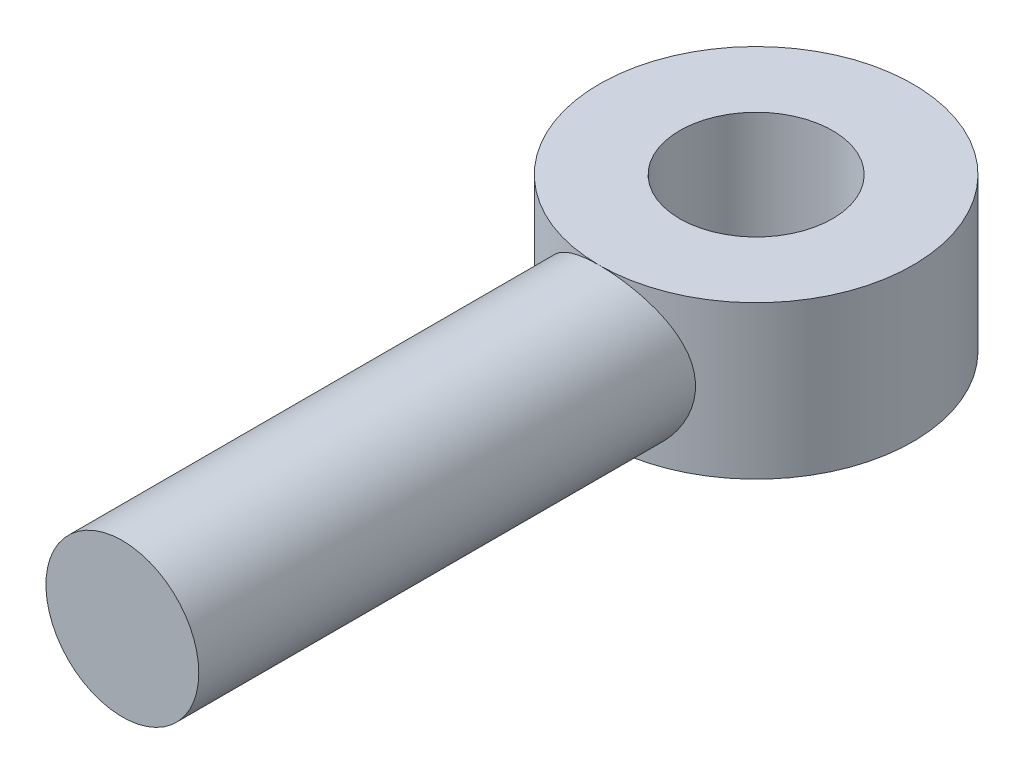
ISO-10303-21;
HEADER;
FILE_DESCRIPTION(('STEP AP214'),'2;1');
FILE_NAME('part.step','',(''),(''),'','','');
FILE_SCHEMA(('AUTOMOTIVE_DESIGN { 1 0 10303 214 1 1 1 1 }'));
ENDSEC;
DATA;
#1=APPLICATION_CONTEXT('core data for automotive mechanical design processes');
#2=APPLICATION_PROTOCOL_DEFINITION('international standard','automotive_design',2000,#1);
#3=PRODUCT_CONTEXT('',#1,'mechanical');
#4=PRODUCT('Part','Part','',(#3));
#5=PRODUCT_RELATED_PRODUCT_CATEGORY('part','',(#4));
#6=PRODUCT_DEFINITION_FORMATION('','',#4);
#7=PRODUCT_DEFINITION_CONTEXT('part definition',#1,'design');
#8=PRODUCT_DEFINITION('design','',#6,#7);
#9=PRODUCT_DEFINITION_SHAPE('','',#8);
#10=(LENGTH_UNIT() NAMED_UNIT(*) SI_UNIT(.MILLI.,.METRE.));
#11=(NAMED_UNIT(*) PLANE_ANGLE_UNIT() SI_UNIT($,.RADIAN.));
#12=(NAMED_UNIT(*) SI_UNIT($,.STERADIAN.) SOLID_ANGLE_UNIT());
#13=UNCERTAINTY_MEASURE_WITH_UNIT(LENGTH_MEASURE(1.E-05),#10,'distance_accuracy_value','');
#14=(GEOMETRIC_REPRESENTATION_CONTEXT(3) GLOBAL_UNCERTAINTY_ASSIGNED_CONTEXT((#13)) GLOBAL_UNIT_ASSIGNED_CONTEXT((#10,
#11,#12)) REPRESENTATION_CONTEXT('',''));
#15=CARTESIAN_POINT('',(0.,0.,0.));
#16=DIRECTION('',(0.,0.,1.));
#17=DIRECTION('',(1.,0.,0.));
#18=AXIS2_PLACEMENT_3D('',#15,#16,#17);
#19=CARTESIAN_POINT('',(0.,0.,130.));
#20=DIRECTION('',(0.,0.,-1.));
#21=DIRECTION('',(-1.,0.,0.));
#22=AXIS2_PLACEMENT_3D('',#19,#20,#21);
#23=CYLINDRICAL_SURFACE('',#22,20.);
#24=CARTESIAN_POINT('',(0.,0.,130.));
#25=DIRECTION('',(0.,0.,1.));
#26=DIRECTION('',(1.,0.,0.));
#27=AXIS2_PLACEMENT_3D('',#24,#25,#26);
#28=CIRCLE('',#27,20.);
#29=CARTESIAN_POINT('',(20.,0.,130.));
#30=VERTEX_POINT('',#29);
#31=EDGE_CURVE('E11',#30,#30,#28,.T.);
#32=ORIENTED_EDGE('',*,*,#31,.F.);
#33=EDGE_LOOP('',(#32));
#34=FACE_BOUND('',#33,.T.);
#35=CARTESIAN_POINT('',(-20.,0.,0.));
#36=CARTESIAN_POINT('',(-19.9999968305717,0.523388942620858,4.01317243572069E-06));
#37=CARTESIAN_POINT('',(-19.9794268216867,1.04684781891932,0.0114986192323871));
#38=CARTESIAN_POINT('',(-19.8974037196796,2.089772356522,0.0570611875570546));
#39=CARTESIAN_POINT('',(-19.8359302852922,2.60923590086667,0.0911403810986639));
#40=CARTESIAN_POINT('',(-19.672741328074,3.64095356517407,0.180702079364951));
#41=CARTESIAN_POINT('',(-19.5709479610997,4.1531917424507,0.236225981365262));
#42=CARTESIAN_POINT('',(-19.3283802054113,5.16572816217148,0.366698157030428));
#43=CARTESIAN_POINT('',(-19.1876099433925,5.66602766254064,0.441644374295622));
#44=CARTESIAN_POINT('',(-18.869434160805,6.64906067789953,0.608046821209087));
#45=CARTESIAN_POINT('',(-18.6922205829192,7.131871237707,0.699416246389992));
#46=CARTESIAN_POINT('',(-18.3023623602809,8.07999363351323,0.896145800921608));
#47=CARTESIAN_POINT('',(-18.0897168862446,8.54530505963211,1.0015062577208));
#48=CARTESIAN_POINT('',(-17.6307323022821,9.45607015952388,1.2232380255342));
#49=CARTESIAN_POINT('',(-17.3844024280961,9.90152923226694,1.33960631568466));
#50=CARTESIAN_POINT('',(-16.85954483436,10.7709664066188,1.58041765937314));
#51=CARTESIAN_POINT('',(-16.5810053002478,11.1949365435079,1.70486366844396));
#52=CARTESIAN_POINT('',(-15.9704472791634,12.051665131002,1.96870710493953));
#53=CARTESIAN_POINT('',(-15.6359529666301,12.4825347573725,2.10851401122974));
#54=CARTESIAN_POINT('',(-14.9333125894561,13.3151396216145,2.39033786816231));
#55=CARTESIAN_POINT('',(-14.5651648486048,13.7168734064982,2.53235492859543));
#56=CARTESIAN_POINT('',(-13.7968244500466,14.4894656526114,2.81513198905908));
#57=CARTESIAN_POINT('',(-13.3966116809057,14.8603044341186,2.95589113762522));
#58=CARTESIAN_POINT('',(-12.566397661536,15.5686644264076,3.23257220903354));
#59=CARTESIAN_POINT('',(-12.1364065162212,15.9061968459155,3.36849574930764));
#60=CARTESIAN_POINT('',(-11.2203326518424,16.5663136468508,3.64063791338961));
#61=CARTESIAN_POINT('',(-10.7324219186742,16.8865865977177,3.77632684070432));
#62=CARTESIAN_POINT('',(-9.72786239205824,17.4845752377918,4.03477334660886));
#63=CARTESIAN_POINT('',(-9.2112120516353,17.7622886331061,4.15753022807049));
#64=CARTESIAN_POINT('',(-8.15272814269211,18.2723277953687,4.38652406173828));
#65=CARTESIAN_POINT('',(-7.61090634207556,18.5046745125341,4.49276863464));
#66=CARTESIAN_POINT('',(-6.50577987088603,18.9215084398331,4.68561782694671));
#67=CARTESIAN_POINT('',(-5.94247735404095,19.106000433644,4.77222440930521));
#68=CARTESIAN_POINT('',(-4.8378796667853,19.4139363736665,4.91796645956195));
#69=CARTESIAN_POINT('',(-4.2976978554366,19.5406818811969,4.97857097168053));
#70=CARTESIAN_POINT('',(-3.2067637734702,19.74905031012,5.07868534418987));
#71=CARTESIAN_POINT('',(-2.65601194377872,19.8306751094992,5.11819608253045));
#72=CARTESIAN_POINT('',(-1.54874415015169,19.9477113118532,5.17496417517245));
#73=CARTESIAN_POINT('',(-0.992231087671967,19.9831449354701,5.19223222945096));
#74=CARTESIAN_POINT('',(0.122037503677238,20.0073884834786,5.20403895871758));
#75=CARTESIAN_POINT('',(0.679792959716126,19.9962010725132,5.19857893273778));
#76=CARTESIAN_POINT('',(1.74567623415329,19.9302213833427,5.16648781104645));
#77=CARTESIAN_POINT('',(2.25409128865666,19.8791142120183,5.14164610519374));
#78=CARTESIAN_POINT('',(3.26428611648465,19.7384009904537,5.07360475855797));
#79=CARTESIAN_POINT('',(3.76606633018293,19.6487975086811,5.0304063425338));
#80=CARTESIAN_POINT('',(4.75962253932193,19.4320498378947,4.92669231767144));
#81=CARTESIAN_POINT('',(5.25139820934887,19.3049044298499,4.86617614650711));
#82=CARTESIAN_POINT('',(6.2218392267423,19.0143442936939,4.72924568030035));
#83=CARTESIAN_POINT('',(6.7005041139081,18.8509282942794,4.65283082800661));
#84=CARTESIAN_POINT('',(7.64865864616354,18.486741427241,4.48464265935454));
#85=CARTESIAN_POINT('',(8.11791992572887,18.2854708356326,4.39266575970082));
#86=CARTESIAN_POINT('',(9.03755958527781,17.8488552650095,4.19620486474691));
#87=CARTESIAN_POINT('',(9.48793797375208,17.6135103013165,4.0917208750706));
#88=CARTESIAN_POINT('',(10.3677422660908,17.1104290237155,3.87248260184404));
#89=CARTESIAN_POINT('',(10.7971628785453,16.842684588368,3.75772574512106));
#90=CARTESIAN_POINT('',(11.6330589464549,16.2765718780554,3.52037635822777));
#91=CARTESIAN_POINT('',(12.0395323741021,15.9782009032149,3.39778313760461));
#92=CARTESIAN_POINT('',(12.863682889014,15.3240667570328,3.13590992994648));
#93=CARTESIAN_POINT('',(13.2790186759641,14.9655519625482,2.99612617865294));
#94=CARTESIAN_POINT('',(14.078367408392,14.216179079936,2.71368862343353));
#95=CARTESIAN_POINT('',(14.4623786187515,13.8253192025752,2.57103466106698));
#96=CARTESIAN_POINT('',(15.1973430574402,13.0131030710756,2.28635806172386));
#97=CARTESIAN_POINT('',(15.5482815331805,12.5917333543721,2.14433573315854));
#98=CARTESIAN_POINT('',(16.2151672423039,11.7204718512993,1.86460781794859));
#99=CARTESIAN_POINT('',(16.531097956468,11.270566755972,1.72690429101785));
#100=CARTESIAN_POINT('',(17.1431340531287,10.3175577173507,1.45189126555769));
#101=CARTESIAN_POINT('',(17.4370179656996,9.81288157514576,1.31507040979293));
#102=CARTESIAN_POINT('',(17.9806141053257,8.77720553084866,1.05519998554068));
#103=CARTESIAN_POINT('',(18.2303495816285,8.24621967361891,0.932143181307591));
#104=CARTESIAN_POINT('',(18.6832005144118,7.16124018983159,0.704253555424461));
#105=CARTESIAN_POINT('',(18.8863402422159,6.60725871990656,0.599411252933625));
#106=CARTESIAN_POINT('',(19.243659810527,5.48005264413348,0.412076840563447));
#107=CARTESIAN_POINT('',(19.3978459626311,4.90683052953263,0.329581849640985));
#108=CARTESIAN_POINT('',(19.645061851139,3.79107033951734,0.195929883504306));
#109=CARTESIAN_POINT('',(19.7419136598108,3.24961052690212,0.142835450341036));
#110=CARTESIAN_POINT('',(19.8907719356027,2.15873788121099,0.0608061137735247));
#111=CARTESIAN_POINT('',(19.9427808520116,1.6093254841668,0.031869890866693));
#112=CARTESIAN_POINT('',(20.0011613044728,0.507626350897896,-0.000632076707997484));
#113=CARTESIAN_POINT('',(20.0075573818325,-0.044658679645889,-0.00421146423584393));
#114=CARTESIAN_POINT('',(19.9746754877677,-1.14742133720939,0.0141182810160074));
#115=CARTESIAN_POINT('',(19.9354002410131,-1.69789907008462,0.0360258932867451));
#116=CARTESIAN_POINT('',(19.8180616690526,-2.73666509224934,0.100927900541464));
#117=CARTESIAN_POINT('',(19.7443346264375,-3.22560009382029,0.141559200273443));
#118=CARTESIAN_POINT('',(19.561358817663,-4.19480844496707,0.241310643369689));
#119=CARTESIAN_POINT('',(19.4521129563569,-4.67508249947639,0.300429274760149));
#120=CARTESIAN_POINT('',(19.1992167904412,-5.62417518406684,0.435342264777415));
#121=CARTESIAN_POINT('',(19.0555586890846,-6.09299119154401,0.511140402146145));
#122=CARTESIAN_POINT('',(18.7351815381846,-7.01654553097573,0.67721023391045));
#123=CARTESIAN_POINT('',(18.5584605425113,-7.47128303241181,0.7674827802459));
#124=CARTESIAN_POINT('',(18.1644902459936,-8.38511598223237,0.96452092435482));
#125=CARTESIAN_POINT('',(17.9457469833307,-8.84344409424218,1.07185540011922));
#126=CARTESIAN_POINT('',(17.4751757554308,-9.74037231705863,1.29684177350694));
#127=CARTESIAN_POINT('',(17.2233335633207,-10.1789638350633,1.41449810048721));
#128=CARTESIAN_POINT('',(16.6881685448745,-11.0344758855177,1.65716123993954));
#129=CARTESIAN_POINT('',(16.4048394082157,-11.4513920493301,1.78216952345093));
#130=CARTESIAN_POINT('',(15.8082550100678,-12.2618225788725,2.03659296822937));
#131=CARTESIAN_POINT('',(15.4949977532382,-12.6553353814332,2.16600842295662));
#132=CARTESIAN_POINT('',(14.8011965601399,-13.4625540455519,2.44181460661079));
#133=CARTESIAN_POINT('',(14.4170778653801,-13.8731282798279,2.58839986508738));
#134=CARTESIAN_POINT('',(13.6152520529316,-14.6608598633508,2.87961340769961));
#135=CARTESIAN_POINT('',(13.1975424684511,-15.038014754121,3.02424154719879));
#136=CARTESIAN_POINT('',(12.3305175951588,-15.7567599552358,3.30782941225126));
#137=CARTESIAN_POINT('',(11.8811927564142,-16.0983394414674,3.446787404839));
#138=CARTESIAN_POINT('',(10.9533660611204,-16.7434468012009,3.71538427730807));
#139=CARTESIAN_POINT('',(10.4748645775929,-17.0469751610326,3.84502327628605));
#140=CARTESIAN_POINT('',(9.48066570196958,-17.6196797082761,4.09423265800721));
#141=CARTESIAN_POINT('',(8.96438796521355,-17.8879718071139,4.21352491994819));
#142=CARTESIAN_POINT('',(7.90738861239793,-18.3796880996614,4.43542928805022));
#143=CARTESIAN_POINT('',(7.3666662839979,-18.6031109848023,4.53804090771929));
#144=CARTESIAN_POINT('',(6.2650514448457,-19.002424139093,4.72347970052555));
#145=CARTESIAN_POINT('',(5.70417293003325,-19.1783466953019,4.80632030800294));
#146=CARTESIAN_POINT('',(4.56644105287026,-19.4806042531883,4.94974207573147));
#147=CARTESIAN_POINT('',(3.98958947401219,-19.6069447673003,5.01032571042141));
#148=CARTESIAN_POINT('',(2.87669274063408,-19.7993606112998,5.10300407492648));
#149=CARTESIAN_POINT('',(2.34156703775076,-19.8697877577311,5.13714925922343));
#150=CARTESIAN_POINT('',(1.26645882191761,-19.9671567712254,5.18443043910161));
#151=CARTESIAN_POINT('',(0.726476610201812,-19.9941013169262,5.19756772882158));
#152=CARTESIAN_POINT('',(-0.353841895046366,-20.0041629376577,5.20246882357896));
#153=CARTESIAN_POINT('',(-0.894178053739348,-19.9872918354955,5.19423839428321));
#154=CARTESIAN_POINT('',(-1.97097070612981,-19.9099627390338,5.15664438643504));
#155=CARTESIAN_POINT('',(-2.5074272891783,-19.8495057518163,5.12728129616739));
#156=CARTESIAN_POINT('',(-3.53994009921945,-19.6907320424779,5.05063023868001));
#157=CARTESIAN_POINT('',(-4.03647505589379,-19.594930667224,5.0045358882931));
#158=CARTESIAN_POINT('',(-5.01908861231045,-19.3665473161921,4.89551152189423));
#159=CARTESIAN_POINT('',(-5.50516775524627,-19.2339672561128,4.83258238276535));
#160=CARTESIAN_POINT('',(-6.46394216193547,-18.9333015461409,4.69132727192172));
#161=CARTESIAN_POINT('',(-6.93663628928139,-18.7652128917054,4.61299999733999));
#162=CARTESIAN_POINT('',(-7.86596544838241,-18.3950209853709,4.44268811188943));
#163=CARTESIAN_POINT('',(-8.32259973890461,-18.1929161659588,4.35070287166523));
#164=CARTESIAN_POINT('',(-9.23717776410709,-17.746681692267,4.15073515202218));
#165=CARTESIAN_POINT('',(-9.69429483288759,-17.5010940721388,4.04222682923968));
#166=CARTESIAN_POINT('',(-10.586196768316,-16.9764589212949,3.81491278669627));
#167=CARTESIAN_POINT('',(-11.0209811863197,-16.6974107187593,3.69610686019386));
#168=CARTESIAN_POINT('',(-11.8663873684859,-16.1075943974386,3.45075771250078));
#169=CARTESIAN_POINT('',(-12.2770005902233,-15.7968151693342,3.32421178772682));
#170=CARTESIAN_POINT('',(-13.0721667382812,-15.1453844253681,3.06614476377586));
#171=CARTESIAN_POINT('',(-13.4567174281318,-14.8047303516348,2.93462323913938));
#172=CARTESIAN_POINT('',(-14.2333485848662,-14.0615582164376,2.65684752712526));
#173=CARTESIAN_POINT('',(-14.6226757284358,-13.6562373957274,2.51038041845914));
#174=CARTESIAN_POINT('',(-15.3660965896041,-12.8140012669965,2.21874451882427));
#175=CARTESIAN_POINT('',(-15.7201877678029,-12.3770836857602,2.07357582211518));
#176=CARTESIAN_POINT('',(-16.3913645557949,-11.4734552508627,1.78841035403428));
#177=CARTESIAN_POINT('',(-16.7084179655725,-11.0067190106288,1.64841815422237));
#178=CARTESIAN_POINT('',(-17.3030015870287,-10.0461511030002,1.37785445663122));
#179=CARTESIAN_POINT('',(-17.5805350436145,-9.55232166479319,1.24728218583463));
#180=CARTESIAN_POINT('',(-18.1000843263115,-8.52787710874607,0.996690788710569));
#181=CARTESIAN_POINT('',(-18.3410789054338,-7.99666119823848,0.87700323612811));
#182=CARTESIAN_POINT('',(-18.7768482512266,-6.91170838329375,0.656186483701373));
#183=CARTESIAN_POINT('',(-18.9716153009554,-6.35796773676187,0.555060383030421));
#184=CARTESIAN_POINT('',(-19.3119578255838,-5.23375481299304,0.375704687397156));
#185=CARTESIAN_POINT('',(-19.4576771102245,-4.66333687519719,0.297408246973686));
#186=CARTESIAN_POINT('',(-19.6985224278219,-3.50930273600832,0.166759313476473));
#187=CARTESIAN_POINT('',(-19.7936844692383,-2.92569623761593,0.114388357275333));
#188=CARTESIAN_POINT('',(-19.9084554435934,-1.95082836008772,0.0509417301028625));
#189=CARTESIAN_POINT('',(-19.9427575147275,-1.56174488591737,0.0318766985234816));
#190=CARTESIAN_POINT('',(-19.9885316787378,-0.781787350933607,0.00640394546348858));
#191=CARTESIAN_POINT('',(-20.0000023672096,-0.390913181453099,-2.99739233448784E-06));
#192=CARTESIAN_POINT('',(-20.,0.,0.));
#193=B_SPLINE_CURVE_WITH_KNOTS('',3,(#35,#36,#37,#38,#39,#40,#41,#42,#43,#44,#45,#46,#47,#48,
#49,#50,#51,#52,#53,#54,#55,#56,#57,#58,#59,#60,#61,#62,#63,#64,#65,#66,#67,#68,#69,#70,#71,#72,
#73,#74,#75,#76,#77,#78,#79,#80,#81,#82,#83,#84,#85,#86,#87,#88,#89,#90,#91,#92,#93,#94,#95,#96,
#97,#98,#99,#100,#101,#102,#103,#104,#105,#106,#107,#108,#109,#110,#111,#112,#113,#114,#115,
#116,#117,#118,#119,#120,#121,#122,#123,#124,#125,#126,#127,#128,#129,#130,#131,#132,#133,#134,
#135,#136,#137,#138,#139,#140,#141,#142,#143,#144,#145,#146,#147,#148,#149,#150,#151,#152,#153,
#154,#155,#156,#157,#158,#159,#160,#161,#162,#163,#164,#165,#166,#167,#168,#169,#170,#171,#172,
#173,#174,#175,#176,#177,#178,#179,#180,#181,#182,#183,#184,#185,#186,#187,#188,#189,#190,#191,
#192),.UNSPECIFIED.,.T.,.F.,(4,2,2,2,2,2,2,2,2,2,2,2,2,2,2,2,2,2,2,2,2,2,2,2,2,2,2,2,2,2,2,2,2,
2,2,2,2,2,2,2,2,2,2,2,2,2,2,2,2,2,2,2,2,2,2,2,2,2,2,2,2,2,2,2,2,2,2,2,2,2,2,2,2,2,2,2,2,2,4),
(0.,1.56976297307914,3.14030717299439,4.71389845845995,6.2873232029436,7.85266391733588,
9.41804127368751,10.9829902852263,12.5485151546987,14.2360110657877,15.9235910735486,
17.6122379575074,19.3003146020933,21.0956195861953,22.8910213003906,24.6855919314267,
26.4799831035137,28.1521866674122,29.8243206266352,31.4956498949671,33.1668836391493,
34.6998155253501,36.2326451504589,37.7655245538443,39.2984576939508,40.8532632995257,
42.4080682059775,43.9632636593342,45.5185963285209,47.2153360304475,48.9121696537607,
50.6097566276352,52.308141266146,54.1052969288522,55.9015033439573,57.6967719950959,
59.4918090877055,61.147319417225,62.8027393181455,64.4572684778491,66.1116989363549,
67.5983933276695,69.0849661624826,70.5718761277231,72.058873642183,73.6144939359473,
75.1707850803836,76.7273886867059,78.2840961460052,80.0252457326822,81.766523299975,
83.508329127176,85.2501126901588,87.0295359310843,88.8090110596929,90.5872735759092,
92.3653383323319,93.9856745254347,95.6059108979368,97.225710126346,98.8454719293735,
100.367111042008,101.888670911598,103.41035957886,104.932118386898,106.52084387718,
108.109601271157,109.698916823357,111.288368585178,113.028771741899,114.769300236001,
116.511330829044,118.253218304739,120.037230475656,121.821540249549,123.60057184094,
125.378334645597,126.550700443103,127.723138352969),.UNSPECIFIED.);
#194=CARTESIAN_POINT('',(0.,-20.,5.20044101858887));
#195=VERTEX_POINT('',#194);
#196=CARTESIAN_POINT('',(0.,20.,5.20044101858887));
#197=VERTEX_POINT('',#196);
#198=EDGE_CURVE('E52',#195,#197,#193,.T.);
#199=ORIENTED_EDGE('',*,*,#198,.F.);
#200=EDGE_CURVE('E45',#197,#195,#193,.T.);
#201=ORIENTED_EDGE('',*,*,#200,.F.);
#202=EDGE_LOOP('',(#199,#201));
#203=FACE_BOUND('',#202,.T.);
#204=ADVANCED_FACE('F37',(#34,#203),#23,.T.);
#205=CARTESIAN_POINT('',(0.,0.,130.));
#206=DIRECTION('',(0.,0.,1.));
#207=DIRECTION('',(1.,0.,0.));
#208=AXIS2_PLACEMENT_3D('',#205,#206,#207);
#209=PLANE('',#208);
#210=ORIENTED_EDGE('',*,*,#31,.T.);
#211=EDGE_LOOP('',(#210));
#212=FACE_BOUND('',#211,.T.);
#213=ADVANCED_FACE('F71',(#212),#209,.T.);
#214=CARTESIAN_POINT('',(0.,20.,-35.8580562570614));
#215=DIRECTION('',(0.,-1.,0.));
#216=DIRECTION('',(0.,0.,-1.));
#217=AXIS2_PLACEMENT_3D('',#214,#215,#216);
#218=CYLINDRICAL_SURFACE('',#217,41.0584972756503);
#219=CARTESIAN_POINT('',(0.,20.,-35.8580562570614));
#220=DIRECTION('',(0.,1.,0.));
#221=DIRECTION('',(0.,0.,1.));
#222=AXIS2_PLACEMENT_3D('',#219,#220,#221);
#223=CIRCLE('',#222,41.0584972756503);
#224=EDGE_CURVE('E59',#197,#197,#223,.T.);
#225=ORIENTED_EDGE('',*,*,#224,.F.);
#226=ORIENTED_EDGE('',*,*,#200,.T.);
#227=CARTESIAN_POINT('',(0.,-20.,-35.8580562570614));
#228=DIRECTION('',(0.,1.,0.));
#229=DIRECTION('',(0.,0.,1.));
#230=AXIS2_PLACEMENT_3D('',#227,#228,#229);
#231=CIRCLE('',#230,41.0584972756503);
#232=EDGE_CURVE('E57',#195,#195,#231,.T.);
#233=ORIENTED_EDGE('',*,*,#232,.T.);
#234=ORIENTED_EDGE('',*,*,#198,.T.);
#235=EDGE_LOOP('',(#225,#226,#233,#234));
#236=FACE_BOUND('',#235,.T.);
#237=ADVANCED_FACE('F55',(#236),#218,.T.);
#238=CARTESIAN_POINT('',(0.,20.,0.));
#239=DIRECTION('',(0.,1.,0.));
#240=DIRECTION('',(0.,0.,1.));
#241=AXIS2_PLACEMENT_3D('',#238,#239,#240);
#242=PLANE('',#241);
#243=CARTESIAN_POINT('',(0.,20.,-35.8580562570614));
#244=DIRECTION('',(0.,1.,0.));
#245=DIRECTION('',(0.,0.,1.));
#246=AXIS2_PLACEMENT_3D('',#243,#244,#245);
#247=CIRCLE('',#246,20.);
#248=CARTESIAN_POINT('',(0.,20.,-15.8580562570614));
#249=VERTEX_POINT('',#248);
#250=EDGE_CURVE('E127',#249,#249,#247,.T.);
#251=ORIENTED_EDGE('',*,*,#250,.F.);
#252=EDGE_LOOP('',(#251));
#253=FACE_BOUND('',#252,.T.);
#254=ORIENTED_EDGE('',*,*,#224,.T.);
#255=EDGE_LOOP('',(#254));
#256=FACE_BOUND('',#255,.T.);
#257=ADVANCED_FACE('F70',(#253,#256),#242,.T.);
#258=CARTESIAN_POINT('',(0.,-20.,0.));
#259=DIRECTION('',(0.,1.,0.));
#260=DIRECTION('',(0.,0.,1.));
#261=AXIS2_PLACEMENT_3D('',#258,#259,#260);
#262=PLANE('',#261);
#263=CARTESIAN_POINT('',(0.,-20.,-35.8580562570614));
#264=DIRECTION('',(0.,1.,0.));
#265=DIRECTION('',(0.,0.,1.));
#266=AXIS2_PLACEMENT_3D('',#263,#264,#265);
#267=CIRCLE('',#266,20.);
#268=CARTESIAN_POINT('',(0.,-20.,-15.8580562570614));
#269=VERTEX_POINT('',#268);
#270=EDGE_CURVE('E124',#269,#269,#267,.T.);
#271=ORIENTED_EDGE('',*,*,#270,.T.);
#272=EDGE_LOOP('',(#271));
#273=FACE_BOUND('',#272,.T.);
#274=ORIENTED_EDGE('',*,*,#232,.F.);
#275=EDGE_LOOP('',(#274));
#276=FACE_BOUND('',#275,.T.);
#277=ADVANCED_FACE('F72',(#273,#276),#262,.F.);
#278=CARTESIAN_POINT('',(0.,-20.,-35.8580562570614));
#279=DIRECTION('',(0.,1.,0.));
#280=DIRECTION('',(0.,0.,1.));
#281=AXIS2_PLACEMENT_3D('',#278,#279,#280);
#282=CYLINDRICAL_SURFACE('',#281,20.);
#283=ORIENTED_EDGE('',*,*,#270,.F.);
#284=EDGE_LOOP('',(#283));
#285=FACE_BOUND('',#284,.T.);
#286=ORIENTED_EDGE('',*,*,#250,.T.);
#287=EDGE_LOOP('',(#286));
#288=FACE_BOUND('',#287,.T.);
#289=ADVANCED_FACE('F108',(#285,#288),#282,.F.);
#290=CLOSED_SHELL('',(#204,#213,#237,#257,#277,#289));
#291=MANIFOLD_SOLID_BREP('B2',#290);
#292=ADVANCED_BREP_SHAPE_REPRESENTATION('',(#18,#291),#14);
#293=SHAPE_DEFINITION_REPRESENTATION(#9,#292);
ENDSEC;
END-ISO-10303-21;
